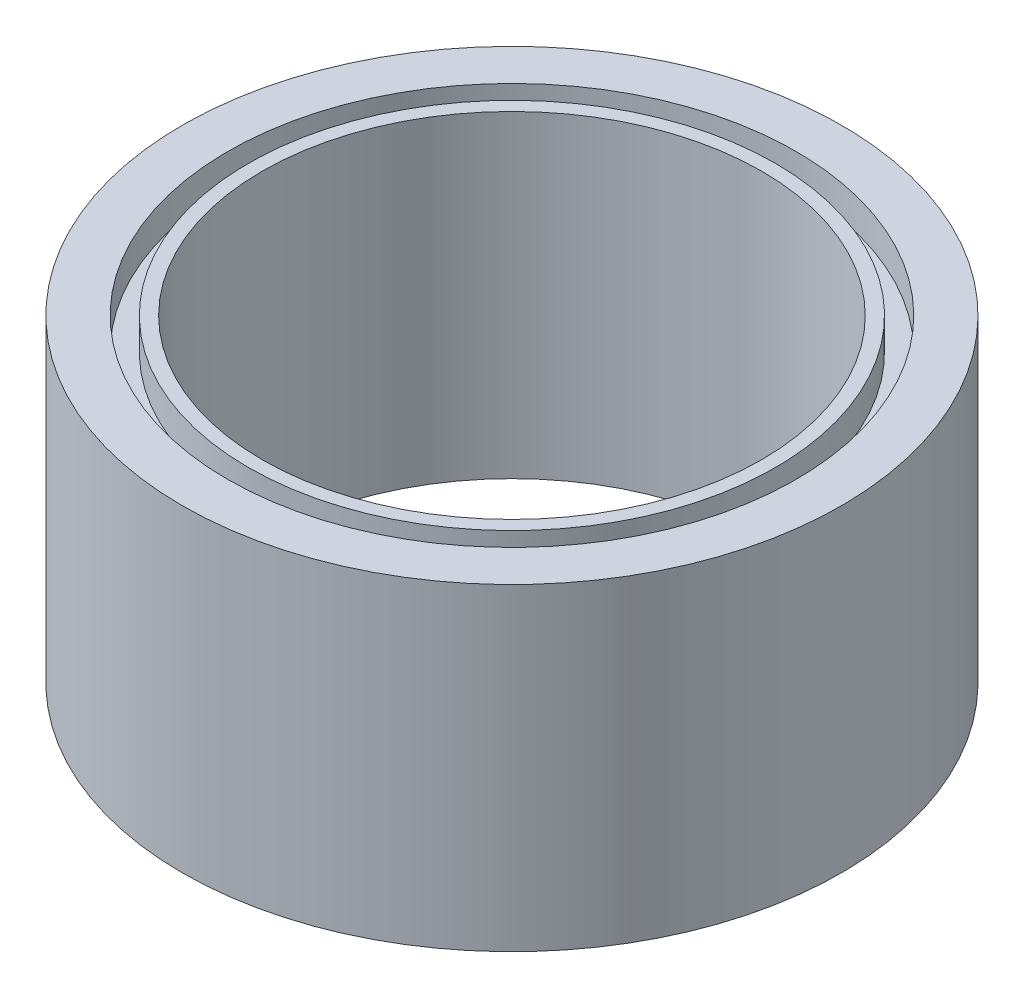
ISO-10303-21;
HEADER;
FILE_DESCRIPTION(('STEP AP214'),'2;1');
FILE_NAME('part.step','',(''),(''),'','','');
FILE_SCHEMA(('AUTOMOTIVE_DESIGN { 1 0 10303 214 1 1 1 1 }'));
ENDSEC;
DATA;
#1=APPLICATION_CONTEXT('core data for automotive mechanical design processes');
#2=APPLICATION_PROTOCOL_DEFINITION('international standard','automotive_design',2000,#1);
#3=PRODUCT_CONTEXT('',#1,'mechanical');
#4=PRODUCT('Part','Part','',(#3));
#5=PRODUCT_RELATED_PRODUCT_CATEGORY('part','',(#4));
#6=PRODUCT_DEFINITION_FORMATION('','',#4);
#7=PRODUCT_DEFINITION_CONTEXT('part definition',#1,'design');
#8=PRODUCT_DEFINITION('design','',#6,#7);
#9=PRODUCT_DEFINITION_SHAPE('','',#8);
#10=(LENGTH_UNIT() NAMED_UNIT(*) SI_UNIT(.MILLI.,.METRE.));
#11=(NAMED_UNIT(*) PLANE_ANGLE_UNIT() SI_UNIT($,.RADIAN.));
#12=(NAMED_UNIT(*) SI_UNIT($,.STERADIAN.) SOLID_ANGLE_UNIT());
#13=UNCERTAINTY_MEASURE_WITH_UNIT(LENGTH_MEASURE(1.E-05),#10,'distance_accuracy_value','');
#14=(GEOMETRIC_REPRESENTATION_CONTEXT(3) GLOBAL_UNCERTAINTY_ASSIGNED_CONTEXT((#13)) GLOBAL_UNIT_ASSIGNED_CONTEXT((#10,
#11,#12)) REPRESENTATION_CONTEXT('',''));
#15=CARTESIAN_POINT('',(0.,0.,0.));
#16=DIRECTION('',(0.,0.,1.));
#17=DIRECTION('',(1.,0.,0.));
#18=AXIS2_PLACEMENT_3D('',#15,#16,#17);
#19=CARTESIAN_POINT('',(0.,70.,0.));
#20=DIRECTION('',(0.,-1.,0.));
#21=DIRECTION('',(0.,0.,-1.));
#22=AXIS2_PLACEMENT_3D('',#19,#20,#21);
#23=CYLINDRICAL_SURFACE('',#22,72.55);
#24=CARTESIAN_POINT('',(0.,70.,0.));
#25=DIRECTION('',(0.,1.,0.));
#26=DIRECTION('',(0.,0.,1.));
#27=AXIS2_PLACEMENT_3D('',#24,#25,#26);
#28=CIRCLE('',#27,72.55);
#29=CARTESIAN_POINT('',(0.,70.,72.55));
#30=VERTEX_POINT('',#29);
#31=EDGE_CURVE('E10',#30,#30,#28,.T.);
#32=ORIENTED_EDGE('',*,*,#31,.F.);
#33=EDGE_LOOP('',(#32));
#34=FACE_BOUND('',#33,.T.);
#35=CARTESIAN_POINT('',(0.,0.,0.));
#36=DIRECTION('',(0.,1.,0.));
#37=DIRECTION('',(0.,0.,1.));
#38=AXIS2_PLACEMENT_3D('',#35,#36,#37);
#39=CIRCLE('',#38,72.55);
#40=CARTESIAN_POINT('',(0.,0.,72.55));
#41=VERTEX_POINT('',#40);
#42=EDGE_CURVE('E34',#41,#41,#39,.T.);
#43=ORIENTED_EDGE('',*,*,#42,.T.);
#44=EDGE_LOOP('',(#43));
#45=FACE_BOUND('',#44,.T.);
#46=ADVANCED_FACE('F31',(#34,#45),#23,.T.);
#47=CARTESIAN_POINT('',(0.,70.,0.));
#48=DIRECTION('',(0.,1.,0.));
#49=DIRECTION('',(0.,0.,1.));
#50=AXIS2_PLACEMENT_3D('',#47,#48,#49);
#51=PLANE('',#50);
#52=CARTESIAN_POINT('',(0.,70.,0.));
#53=DIRECTION('',(0.,1.,0.));
#54=DIRECTION('',(0.,0.,1.));
#55=AXIS2_PLACEMENT_3D('',#52,#53,#54);
#56=CIRCLE('',#55,62.55);
#57=CARTESIAN_POINT('',(0.,70.,62.55));
#58=VERTEX_POINT('',#57);
#59=EDGE_CURVE('E43',#58,#58,#56,.T.);
#60=ORIENTED_EDGE('',*,*,#59,.F.);
#61=EDGE_LOOP('',(#60));
#62=FACE_BOUND('',#61,.T.);
#63=ORIENTED_EDGE('',*,*,#31,.T.);
#64=EDGE_LOOP('',(#63));
#65=FACE_BOUND('',#64,.T.);
#66=ADVANCED_FACE('F75',(#62,#65),#51,.T.);
#67=CARTESIAN_POINT('',(0.,0.,0.));
#68=DIRECTION('',(0.,1.,0.));
#69=DIRECTION('',(0.,0.,1.));
#70=AXIS2_PLACEMENT_3D('',#67,#68,#69);
#71=PLANE('',#70);
#72=CARTESIAN_POINT('',(0.,0.,0.));
#73=DIRECTION('',(0.,1.,0.));
#74=DIRECTION('',(0.,0.,1.));
#75=AXIS2_PLACEMENT_3D('',#72,#73,#74);
#76=CIRCLE('',#75,55.);
#77=CARTESIAN_POINT('',(0.,0.,55.));
#78=VERTEX_POINT('',#77);
#79=EDGE_CURVE('E52',#78,#78,#76,.T.);
#80=ORIENTED_EDGE('',*,*,#79,.T.);
#81=EDGE_LOOP('',(#80));
#82=FACE_BOUND('',#81,.T.);
#83=ORIENTED_EDGE('',*,*,#42,.F.);
#84=EDGE_LOOP('',(#83));
#85=FACE_BOUND('',#84,.T.);
#86=ADVANCED_FACE('F61',(#82,#85),#71,.F.);
#87=CARTESIAN_POINT('',(0.,63.,0.));
#88=DIRECTION('',(0.,1.,0.));
#89=DIRECTION('',(0.,0.,1.));
#90=AXIS2_PLACEMENT_3D('',#87,#88,#89);
#91=CYLINDRICAL_SURFACE('',#90,62.55);
#92=CARTESIAN_POINT('',(0.,63.,0.));
#93=DIRECTION('',(0.,1.,0.));
#94=DIRECTION('',(0.,0.,1.));
#95=AXIS2_PLACEMENT_3D('',#92,#93,#94);
#96=CIRCLE('',#95,62.55);
#97=CARTESIAN_POINT('',(0.,63.,62.55));
#98=VERTEX_POINT('',#97);
#99=EDGE_CURVE('E41',#98,#98,#96,.T.);
#100=ORIENTED_EDGE('',*,*,#99,.F.);
#101=EDGE_LOOP('',(#100));
#102=FACE_BOUND('',#101,.T.);
#103=ORIENTED_EDGE('',*,*,#59,.T.);
#104=EDGE_LOOP('',(#103));
#105=FACE_BOUND('',#104,.T.);
#106=ADVANCED_FACE('F85',(#102,#105),#91,.F.);
#107=CARTESIAN_POINT('',(0.,63.,0.));
#108=DIRECTION('',(0.,1.,0.));
#109=DIRECTION('',(0.,0.,1.));
#110=AXIS2_PLACEMENT_3D('',#107,#108,#109);
#111=PLANE('',#110);
#112=CARTESIAN_POINT('',(0.,63.,0.));
#113=DIRECTION('',(0.,1.,0.));
#114=DIRECTION('',(0.,0.,1.));
#115=AXIS2_PLACEMENT_3D('',#112,#113,#114);
#116=CIRCLE('',#115,58.);
#117=CARTESIAN_POINT('',(0.,63.,58.));
#118=VERTEX_POINT('',#117);
#119=EDGE_CURVE('E46',#118,#118,#116,.T.);
#120=ORIENTED_EDGE('',*,*,#119,.F.);
#121=EDGE_LOOP('',(#120));
#122=FACE_BOUND('',#121,.T.);
#123=ORIENTED_EDGE('',*,*,#99,.T.);
#124=EDGE_LOOP('',(#123));
#125=FACE_BOUND('',#124,.T.);
#126=ADVANCED_FACE('F79',(#122,#125),#111,.T.);
#127=CARTESIAN_POINT('',(0.,63.,0.));
#128=DIRECTION('',(0.,1.,0.));
#129=DIRECTION('',(0.,0.,1.));
#130=AXIS2_PLACEMENT_3D('',#127,#128,#129);
#131=CYLINDRICAL_SURFACE('',#130,58.);
#132=ORIENTED_EDGE('',*,*,#119,.T.);
#133=EDGE_LOOP('',(#132));
#134=FACE_BOUND('',#133,.T.);
#135=CARTESIAN_POINT('',(0.,70.,0.));
#136=DIRECTION('',(0.,1.,0.));
#137=DIRECTION('',(0.,0.,1.));
#138=AXIS2_PLACEMENT_3D('',#135,#136,#137);
#139=CIRCLE('',#138,58.);
#140=CARTESIAN_POINT('',(0.,70.,58.));
#141=VERTEX_POINT('',#140);
#142=EDGE_CURVE('E49',#141,#141,#139,.T.);
#143=ORIENTED_EDGE('',*,*,#142,.F.);
#144=EDGE_LOOP('',(#143));
#145=FACE_BOUND('',#144,.T.);
#146=ADVANCED_FACE('F73',(#134,#145),#131,.T.);
#147=CARTESIAN_POINT('',(0.,70.,0.));
#148=DIRECTION('',(0.,1.,0.));
#149=DIRECTION('',(0.,0.,1.));
#150=AXIS2_PLACEMENT_3D('',#147,#148,#149);
#151=CIRCLE('',#150,55.);
#152=CARTESIAN_POINT('',(0.,70.,55.));
#153=VERTEX_POINT('',#152);
#154=EDGE_CURVE('E55',#153,#153,#151,.T.);
#155=ORIENTED_EDGE('',*,*,#154,.F.);
#156=EDGE_LOOP('',(#155));
#157=FACE_BOUND('',#156,.T.);
#158=ORIENTED_EDGE('',*,*,#142,.T.);
#159=EDGE_LOOP('',(#158));
#160=FACE_BOUND('',#159,.T.);
#161=ADVANCED_FACE('F67',(#157,#160),#51,.T.);
#162=CARTESIAN_POINT('',(0.,0.,0.));
#163=DIRECTION('',(0.,1.,0.));
#164=DIRECTION('',(0.,0.,1.));
#165=AXIS2_PLACEMENT_3D('',#162,#163,#164);
#166=CYLINDRICAL_SURFACE('',#165,55.);
#167=ORIENTED_EDGE('',*,*,#79,.F.);
#168=EDGE_LOOP('',(#167));
#169=FACE_BOUND('',#168,.T.);
#170=ORIENTED_EDGE('',*,*,#154,.T.);
#171=EDGE_LOOP('',(#170));
#172=FACE_BOUND('',#171,.T.);
#173=ADVANCED_FACE('F64',(#169,#172),#166,.F.);
#174=CLOSED_SHELL('',(#46,#66,#86,#106,#126,#146,#161,#173));
#175=MANIFOLD_SOLID_BREP('B2',#174);
#176=ADVANCED_BREP_SHAPE_REPRESENTATION('',(#18,#175),#14);
#177=SHAPE_DEFINITION_REPRESENTATION(#9,#176);
ENDSEC;
END-ISO-10303-21;
